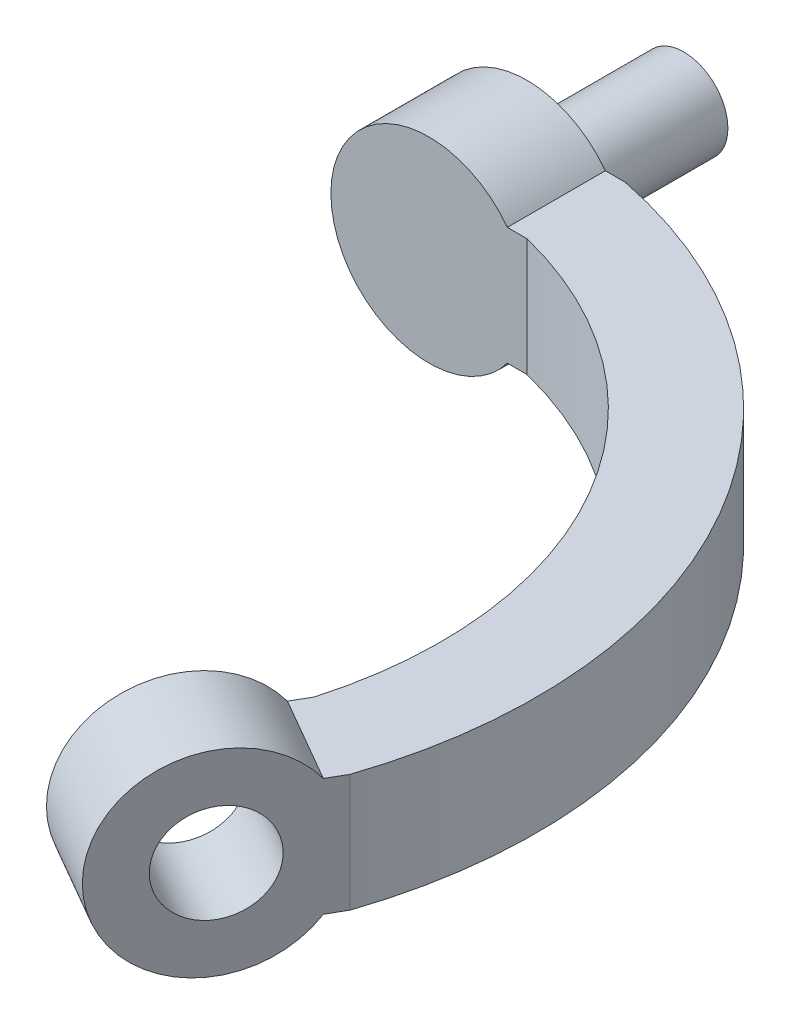
ISO-10303-21;
HEADER;
FILE_DESCRIPTION(('STEP AP214'),'2;1');
FILE_NAME('part.step','',(''),(''),'','','');
FILE_SCHEMA(('AUTOMOTIVE_DESIGN { 1 0 10303 214 1 1 1 1 }'));
ENDSEC;
DATA;
#1=APPLICATION_CONTEXT('core data for automotive mechanical design processes');
#2=APPLICATION_PROTOCOL_DEFINITION('international standard','automotive_design',2000,#1);
#3=PRODUCT_CONTEXT('',#1,'mechanical');
#4=PRODUCT('Part','Part','',(#3));
#5=PRODUCT_RELATED_PRODUCT_CATEGORY('part','',(#4));
#6=PRODUCT_DEFINITION_FORMATION('','',#4);
#7=PRODUCT_DEFINITION_CONTEXT('part definition',#1,'design');
#8=PRODUCT_DEFINITION('design','',#6,#7);
#9=PRODUCT_DEFINITION_SHAPE('','',#8);
#10=(LENGTH_UNIT() NAMED_UNIT(*) SI_UNIT(.MILLI.,.METRE.));
#11=(NAMED_UNIT(*) PLANE_ANGLE_UNIT() SI_UNIT($,.RADIAN.));
#12=(NAMED_UNIT(*) SI_UNIT($,.STERADIAN.) SOLID_ANGLE_UNIT());
#13=UNCERTAINTY_MEASURE_WITH_UNIT(LENGTH_MEASURE(1.E-05),#10,'distance_accuracy_value','');
#14=(GEOMETRIC_REPRESENTATION_CONTEXT(3) GLOBAL_UNCERTAINTY_ASSIGNED_CONTEXT((#13)) GLOBAL_UNIT_ASSIGNED_CONTEXT((#10,
#11,#12)) REPRESENTATION_CONTEXT('',''));
#15=CARTESIAN_POINT('',(0.,0.,0.));
#16=DIRECTION('',(0.,0.,1.));
#17=DIRECTION('',(1.,0.,0.));
#18=AXIS2_PLACEMENT_3D('',#15,#16,#17);
#19=CARTESIAN_POINT('',(0.,0.,5.));
#20=DIRECTION('',(0.,0.,-1.));
#21=DIRECTION('',(-1.,0.,0.));
#22=AXIS2_PLACEMENT_3D('',#19,#20,#21);
#23=CYLINDRICAL_SURFACE('',#22,5.);
#24=DIRECTION('',(0.,0.,-1.));
#25=VECTOR('',#24,1.);
#26=CARTESIAN_POINT('',(4.,-3.,5.));
#27=LINE('',#26,#25);
#28=CARTESIAN_POINT('',(4.,-3.,5.));
#29=VERTEX_POINT('',#28);
#30=CARTESIAN_POINT('',(4.,-3.,0.));
#31=VERTEX_POINT('',#30);
#32=EDGE_CURVE('E52',#29,#31,#27,.T.);
#33=ORIENTED_EDGE('',*,*,#32,.F.);
#34=CARTESIAN_POINT('',(0.,0.,5.));
#35=DIRECTION('',(0.,0.,1.));
#36=DIRECTION('',(1.,0.,0.));
#37=AXIS2_PLACEMENT_3D('',#34,#35,#36);
#38=CIRCLE('',#37,5.);
#39=CARTESIAN_POINT('',(4.,3.,5.));
#40=VERTEX_POINT('',#39);
#41=EDGE_CURVE('E11',#40,#29,#38,.T.);
#42=ORIENTED_EDGE('',*,*,#41,.F.);
#43=DIRECTION('',(0.,0.,-1.));
#44=VECTOR('',#43,1.);
#45=CARTESIAN_POINT('',(4.,3.,5.));
#46=LINE('',#45,#44);
#47=CARTESIAN_POINT('',(4.,3.,0.));
#48=VERTEX_POINT('',#47);
#49=EDGE_CURVE('E151',#48,#40,#46,.F.);
#50=ORIENTED_EDGE('',*,*,#49,.F.);
#51=CARTESIAN_POINT('',(0.,0.,0.));
#52=DIRECTION('',(0.,0.,1.));
#53=DIRECTION('',(1.,0.,0.));
#54=AXIS2_PLACEMENT_3D('',#51,#52,#53);
#55=CIRCLE('',#54,5.);
#56=EDGE_CURVE('E41',#48,#31,#55,.T.);
#57=ORIENTED_EDGE('',*,*,#56,.T.);
#58=EDGE_LOOP('',(#33,#42,#50,#57));
#59=FACE_BOUND('',#58,.T.);
#60=ADVANCED_FACE('F38',(#59),#23,.T.);
#61=CARTESIAN_POINT('',(0.,0.,5.));
#62=DIRECTION('',(0.,0.,1.));
#63=DIRECTION('',(1.,0.,0.));
#64=AXIS2_PLACEMENT_3D('',#61,#62,#63);
#65=PLANE('',#64);
#66=DIRECTION('',(1.,0.,0.));
#67=VECTOR('',#66,1.);
#68=CARTESIAN_POINT('',(2.,-3.,4.99999999999998));
#69=LINE('',#68,#67);
#70=CARTESIAN_POINT('',(4.9999999999999,-3.,4.99999999999998));
#71=VERTEX_POINT('',#70);
#72=EDGE_CURVE('E148',#29,#71,#69,.T.);
#73=ORIENTED_EDGE('',*,*,#72,.T.);
#74=DIRECTION('',(0.,1.,0.));
#75=VECTOR('',#74,1.);
#76=CARTESIAN_POINT('',(5.,-3.,4.99999999999998));
#77=LINE('',#76,#75);
#78=CARTESIAN_POINT('',(4.9999999999999,3.,4.99999999999998));
#79=VERTEX_POINT('',#78);
#80=EDGE_CURVE('E135',#71,#79,#77,.T.);
#81=ORIENTED_EDGE('',*,*,#80,.T.);
#82=DIRECTION('',(1.,0.,0.));
#83=VECTOR('',#82,1.);
#84=CARTESIAN_POINT('',(2.,3.,4.99999999999998));
#85=LINE('',#84,#83);
#86=EDGE_CURVE('E123',#40,#79,#85,.T.);
#87=ORIENTED_EDGE('',*,*,#86,.F.);
#88=ORIENTED_EDGE('',*,*,#41,.T.);
#89=EDGE_LOOP('',(#73,#81,#87,#88));
#90=FACE_BOUND('',#89,.T.);
#91=ADVANCED_FACE('F207',(#90),#65,.T.);
#92=CARTESIAN_POINT('',(0.,0.,0.));
#93=DIRECTION('',(0.,0.,1.));
#94=DIRECTION('',(1.,0.,0.));
#95=AXIS2_PLACEMENT_3D('',#92,#93,#94);
#96=PLANE('',#95);
#97=CARTESIAN_POINT('',(0.,0.,0.));
#98=DIRECTION('',(0.,0.,1.));
#99=DIRECTION('',(1.,0.,0.));
#100=AXIS2_PLACEMENT_3D('',#97,#98,#99);
#101=CIRCLE('',#100,2.25);
#102=CARTESIAN_POINT('',(2.25,0.,0.));
#103=VERTEX_POINT('',#102);
#104=EDGE_CURVE('E189',#103,#103,#101,.T.);
#105=ORIENTED_EDGE('',*,*,#104,.T.);
#106=EDGE_LOOP('',(#105));
#107=FACE_BOUND('',#106,.T.);
#108=ORIENTED_EDGE('',*,*,#56,.F.);
#109=DIRECTION('',(1.,0.,0.));
#110=VECTOR('',#109,1.);
#111=CARTESIAN_POINT('',(2.,3.,0.));
#112=LINE('',#111,#110);
#113=CARTESIAN_POINT('',(5.,3.,0.));
#114=VERTEX_POINT('',#113);
#115=EDGE_CURVE('E144',#48,#114,#112,.T.);
#116=ORIENTED_EDGE('',*,*,#115,.T.);
#117=DIRECTION('',(0.,-1.,0.));
#118=VECTOR('',#117,1.);
#119=CARTESIAN_POINT('',(5.,3.,0.));
#120=LINE('',#119,#118);
#121=CARTESIAN_POINT('',(5.,-3.,0.));
#122=VERTEX_POINT('',#121);
#123=EDGE_CURVE('E138',#114,#122,#120,.T.);
#124=ORIENTED_EDGE('',*,*,#123,.T.);
#125=DIRECTION('',(1.,0.,0.));
#126=VECTOR('',#125,1.);
#127=CARTESIAN_POINT('',(2.,-3.,0.));
#128=LINE('',#127,#126);
#129=EDGE_CURVE('E141',#31,#122,#128,.T.);
#130=ORIENTED_EDGE('',*,*,#129,.F.);
#131=EDGE_LOOP('',(#108,#116,#124,#130));
#132=FACE_BOUND('',#131,.T.);
#133=ADVANCED_FACE('F158',(#107,#132),#96,.F.);
#134=CARTESIAN_POINT('',(2.,-3.,0.));
#135=DIRECTION('',(0.,1.,0.));
#136=DIRECTION('',(0.,0.,1.));
#137=AXIS2_PLACEMENT_3D('',#134,#135,#136);
#138=PLANE('',#137);
#139=ORIENTED_EDGE('',*,*,#72,.F.);
#140=ORIENTED_EDGE('',*,*,#32,.T.);
#141=ORIENTED_EDGE('',*,*,#129,.T.);
#142=CARTESIAN_POINT('',(0.,-3.,25.));
#143=DIRECTION('',(0.,1.,0.));
#144=DIRECTION('',(0.,0.,1.));
#145=AXIS2_PLACEMENT_3D('',#142,#143,#144);
#146=CIRCLE('',#145,25.4950975679639);
#147=CARTESIAN_POINT('',(24.150635094611,-3.,33.1698729810778));
#148=VERTEX_POINT('',#147);
#149=EDGE_CURVE('E125',#122,#148,#146,.F.);
#150=ORIENTED_EDGE('',*,*,#149,.T.);
#151=DIRECTION('',(0.499999999999998,0.,-0.866025403784439));
#152=VECTOR('',#151,1.);
#153=CARTESIAN_POINT('',(22.650635094611,-3.,35.7679491924311));
#154=LINE('',#153,#152);
#155=CARTESIAN_POINT('',(23.650635094611,-3.,34.0358983848622));
#156=VERTEX_POINT('',#155);
#157=EDGE_CURVE('E166',#156,#148,#154,.T.);
#158=ORIENTED_EDGE('',*,*,#157,.F.);
#159=DIRECTION('',(-0.86602540378444,0.,-0.499999999999997));
#160=VECTOR('',#159,1.);
#161=CARTESIAN_POINT('',(1.99999999999998,-3.,21.5358983848623));
#162=LINE('',#161,#160);
#163=CARTESIAN_POINT('',(19.3205080756888,-3.,31.5358983848622));
#164=VERTEX_POINT('',#163);
#165=EDGE_CURVE('E173',#156,#164,#162,.T.);
#166=ORIENTED_EDGE('',*,*,#165,.T.);
#167=DIRECTION('',(0.499999999999998,0.,-0.866025403784439));
#168=VECTOR('',#167,1.);
#169=CARTESIAN_POINT('',(18.3205080756888,-3.,33.2679491924311));
#170=LINE('',#169,#168);
#171=CARTESIAN_POINT('',(19.8205080756888,-3.,30.6698729810778));
#172=VERTEX_POINT('',#171);
#173=EDGE_CURVE('E118',#164,#172,#170,.T.);
#174=ORIENTED_EDGE('',*,*,#173,.T.);
#175=CARTESIAN_POINT('',(0.,-3.,25.));
#176=DIRECTION('',(0.,1.,0.));
#177=DIRECTION('',(0.,0.,1.));
#178=AXIS2_PLACEMENT_3D('',#175,#176,#177);
#179=CIRCLE('',#178,20.6155281280883);
#180=EDGE_CURVE('E105',#71,#172,#179,.F.);
#181=ORIENTED_EDGE('',*,*,#180,.F.);
#182=EDGE_LOOP('',(#139,#140,#141,#150,#158,#166,#174,#181));
#183=FACE_BOUND('',#182,.T.);
#184=ADVANCED_FACE('F165',(#183),#138,.F.);
#185=CARTESIAN_POINT('',(2.,3.,4.99999999999998));
#186=DIRECTION('',(0.,-1.,0.));
#187=DIRECTION('',(0.,0.,-1.));
#188=AXIS2_PLACEMENT_3D('',#185,#186,#187);
#189=PLANE('',#188);
#190=ORIENTED_EDGE('',*,*,#115,.F.);
#191=ORIENTED_EDGE('',*,*,#49,.T.);
#192=ORIENTED_EDGE('',*,*,#86,.T.);
#193=CARTESIAN_POINT('',(0.,3.,25.));
#194=DIRECTION('',(0.,1.,0.));
#195=DIRECTION('',(0.,0.,1.));
#196=AXIS2_PLACEMENT_3D('',#193,#194,#195);
#197=CIRCLE('',#196,20.6155281280883);
#198=CARTESIAN_POINT('',(19.8205080756888,3.,30.6698729810778));
#199=VERTEX_POINT('',#198);
#200=EDGE_CURVE('E102',#79,#199,#197,.F.);
#201=ORIENTED_EDGE('',*,*,#200,.T.);
#202=DIRECTION('',(0.499999999999998,0.,-0.866025403784439));
#203=VECTOR('',#202,1.);
#204=CARTESIAN_POINT('',(18.3205080756888,3.,33.2679491924311));
#205=LINE('',#204,#203);
#206=CARTESIAN_POINT('',(19.3205080756888,3.,31.5358983848622));
#207=VERTEX_POINT('',#206);
#208=EDGE_CURVE('E111',#207,#199,#205,.T.);
#209=ORIENTED_EDGE('',*,*,#208,.F.);
#210=DIRECTION('',(-0.86602540378444,0.,-0.499999999999997));
#211=VECTOR('',#210,1.);
#212=CARTESIAN_POINT('',(1.99999999999998,3.,21.5358983848623));
#213=LINE('',#212,#211);
#214=CARTESIAN_POINT('',(23.650635094611,3.,34.0358983848622));
#215=VERTEX_POINT('',#214);
#216=EDGE_CURVE('E176',#215,#207,#213,.T.);
#217=ORIENTED_EDGE('',*,*,#216,.F.);
#218=DIRECTION('',(0.499999999999998,0.,-0.866025403784439));
#219=VECTOR('',#218,1.);
#220=CARTESIAN_POINT('',(22.650635094611,3.,35.7679491924311));
#221=LINE('',#220,#219);
#222=CARTESIAN_POINT('',(24.150635094611,3.,33.1698729810777));
#223=VERTEX_POINT('',#222);
#224=EDGE_CURVE('E117',#215,#223,#221,.T.);
#225=ORIENTED_EDGE('',*,*,#224,.T.);
#226=CARTESIAN_POINT('',(0.,3.,25.));
#227=DIRECTION('',(0.,1.,0.));
#228=DIRECTION('',(0.,0.,1.));
#229=AXIS2_PLACEMENT_3D('',#226,#227,#228);
#230=CIRCLE('',#229,25.4950975679639);
#231=EDGE_CURVE('E126',#114,#223,#230,.F.);
#232=ORIENTED_EDGE('',*,*,#231,.F.);
#233=EDGE_LOOP('',(#190,#191,#192,#201,#209,#217,#225,#232));
#234=FACE_BOUND('',#233,.T.);
#235=ADVANCED_FACE('F121',(#234),#189,.F.);
#236=CARTESIAN_POINT('',(0.,-3.,25.));
#237=DIRECTION('',(0.,1.,0.));
#238=DIRECTION('',(0.,0.,1.));
#239=AXIS2_PLACEMENT_3D('',#236,#237,#238);
#240=CYLINDRICAL_SURFACE('',#239,25.4950975679639);
#241=ORIENTED_EDGE('',*,*,#123,.F.);
#242=ORIENTED_EDGE('',*,*,#231,.T.);
#243=DIRECTION('',(0.,1.,0.));
#244=VECTOR('',#243,1.);
#245=CARTESIAN_POINT('',(24.150635094611,-3.,33.1698729810777));
#246=LINE('',#245,#244);
#247=EDGE_CURVE('E108',#148,#223,#246,.T.);
#248=ORIENTED_EDGE('',*,*,#247,.F.);
#249=ORIENTED_EDGE('',*,*,#149,.F.);
#250=EDGE_LOOP('',(#241,#242,#248,#249));
#251=FACE_BOUND('',#250,.T.);
#252=ADVANCED_FACE('F164',(#251),#240,.T.);
#253=CARTESIAN_POINT('',(0.,-3.,25.));
#254=DIRECTION('',(0.,1.,0.));
#255=DIRECTION('',(0.,0.,1.));
#256=AXIS2_PLACEMENT_3D('',#253,#254,#255);
#257=CYLINDRICAL_SURFACE('',#256,20.6155281280883);
#258=DIRECTION('',(0.,1.,0.));
#259=VECTOR('',#258,1.);
#260=CARTESIAN_POINT('',(19.8205080756888,-3.,30.6698729810777));
#261=LINE('',#260,#259);
#262=EDGE_CURVE('E98',#172,#199,#261,.T.);
#263=ORIENTED_EDGE('',*,*,#262,.T.);
#264=ORIENTED_EDGE('',*,*,#200,.F.);
#265=ORIENTED_EDGE('',*,*,#80,.F.);
#266=ORIENTED_EDGE('',*,*,#180,.T.);
#267=EDGE_LOOP('',(#263,#264,#265,#266));
#268=FACE_BOUND('',#267,.T.);
#269=ADVANCED_FACE('F100',(#268),#257,.F.);
#270=CARTESIAN_POINT('',(22.650635094611,-3.,35.7679491924311));
#271=DIRECTION('',(-0.866025403784439,0.,-0.499999999999998));
#272=DIRECTION('',(-0.499999999999999,0.,0.86602540378444));
#273=AXIS2_PLACEMENT_3D('',#270,#271,#272);
#274=PLANE('',#273);
#275=CARTESIAN_POINT('',(21.650635094611,0.,37.4999999999999));
#276=DIRECTION('',(-0.86602540378444,0.,-0.499999999999999));
#277=DIRECTION('',(-0.499999999999999,0.,0.86602540378444));
#278=AXIS2_PLACEMENT_3D('',#275,#276,#277);
#279=CIRCLE('',#278,2.5);
#280=CARTESIAN_POINT('',(20.400635094611,0.,39.665063509461));
#281=VERTEX_POINT('',#280);
#282=EDGE_CURVE('E182',#281,#281,#279,.T.);
#283=ORIENTED_EDGE('',*,*,#282,.T.);
#284=EDGE_LOOP('',(#283));
#285=FACE_BOUND('',#284,.T.);
#286=CARTESIAN_POINT('',(21.650635094611,0.,37.4999999999999));
#287=DIRECTION('',(-0.86602540378444,0.,-0.499999999999997));
#288=DIRECTION('',(-0.499999999999997,0.,0.86602540378444));
#289=AXIS2_PLACEMENT_3D('',#286,#287,#288);
#290=CIRCLE('',#289,4.99999999999998);
#291=EDGE_CURVE('E172',#156,#215,#290,.T.);
#292=ORIENTED_EDGE('',*,*,#291,.F.);
#293=ORIENTED_EDGE('',*,*,#157,.T.);
#294=ORIENTED_EDGE('',*,*,#247,.T.);
#295=ORIENTED_EDGE('',*,*,#224,.F.);
#296=EDGE_LOOP('',(#292,#293,#294,#295));
#297=FACE_BOUND('',#296,.T.);
#298=ADVANCED_FACE('F170',(#285,#297),#274,.F.);
#299=CARTESIAN_POINT('',(18.3205080756888,3.,33.2679491924311));
#300=DIRECTION('',(0.866025403784439,0.,0.499999999999998));
#301=DIRECTION('',(0.499999999999999,0.,-0.86602540378444));
#302=AXIS2_PLACEMENT_3D('',#299,#300,#301);
#303=PLANE('',#302);
#304=CARTESIAN_POINT('',(17.3205080756888,0.,34.9999999999999));
#305=DIRECTION('',(-0.86602540378444,0.,-0.499999999999999));
#306=DIRECTION('',(-0.499999999999999,0.,0.86602540378444));
#307=AXIS2_PLACEMENT_3D('',#304,#305,#306);
#308=CIRCLE('',#307,2.5);
#309=CARTESIAN_POINT('',(16.0705080756888,0.,37.165063509461));
#310=VERTEX_POINT('',#309);
#311=EDGE_CURVE('E183',#310,#310,#308,.T.);
#312=ORIENTED_EDGE('',*,*,#311,.F.);
#313=EDGE_LOOP('',(#312));
#314=FACE_BOUND('',#313,.T.);
#315=ORIENTED_EDGE('',*,*,#173,.F.);
#316=CARTESIAN_POINT('',(17.3205080756888,0.,34.9999999999999));
#317=DIRECTION('',(-0.86602540378444,0.,-0.499999999999997));
#318=DIRECTION('',(-0.499999999999997,0.,0.86602540378444));
#319=AXIS2_PLACEMENT_3D('',#316,#317,#318);
#320=CIRCLE('',#319,4.99999999999999);
#321=EDGE_CURVE('E114',#164,#207,#320,.T.);
#322=ORIENTED_EDGE('',*,*,#321,.T.);
#323=ORIENTED_EDGE('',*,*,#208,.T.);
#324=ORIENTED_EDGE('',*,*,#262,.F.);
#325=EDGE_LOOP('',(#315,#322,#323,#324));
#326=FACE_BOUND('',#325,.T.);
#327=ADVANCED_FACE('F112',(#314,#326),#303,.F.);
#328=CARTESIAN_POINT('',(0.,0.,25.));
#329=DIRECTION('',(-0.86602540378444,0.,-0.499999999999997));
#330=DIRECTION('',(-0.499999999999997,0.,0.86602540378444));
#331=AXIS2_PLACEMENT_3D('',#328,#329,#330);
#332=CYLINDRICAL_SURFACE('',#331,4.99999999999998);
#333=ORIENTED_EDGE('',*,*,#165,.F.);
#334=ORIENTED_EDGE('',*,*,#291,.T.);
#335=ORIENTED_EDGE('',*,*,#216,.T.);
#336=ORIENTED_EDGE('',*,*,#321,.F.);
#337=EDGE_LOOP('',(#333,#334,#335,#336));
#338=FACE_BOUND('',#337,.T.);
#339=ADVANCED_FACE('F231',(#338),#332,.T.);
#340=CARTESIAN_POINT('',(21.650635094611,0.,37.4999999999999));
#341=DIRECTION('',(-0.86602540378444,0.,-0.499999999999998));
#342=DIRECTION('',(-0.499999999999998,0.,0.86602540378444));
#343=AXIS2_PLACEMENT_3D('',#340,#341,#342);
#344=CYLINDRICAL_SURFACE('',#343,2.5);
#345=ORIENTED_EDGE('',*,*,#282,.F.);
#346=EDGE_LOOP('',(#345));
#347=FACE_BOUND('',#346,.T.);
#348=ORIENTED_EDGE('',*,*,#311,.T.);
#349=EDGE_LOOP('',(#348));
#350=FACE_BOUND('',#349,.T.);
#351=ADVANCED_FACE('F204',(#347,#350),#344,.F.);
#352=CARTESIAN_POINT('',(0.,0.,-8.));
#353=DIRECTION('',(0.,0.,1.));
#354=DIRECTION('',(1.,0.,0.));
#355=AXIS2_PLACEMENT_3D('',#352,#353,#354);
#356=CYLINDRICAL_SURFACE('',#355,2.25);
#357=CARTESIAN_POINT('',(0.,0.,-8.));
#358=DIRECTION('',(0.,0.,1.));
#359=DIRECTION('',(1.,0.,0.));
#360=AXIS2_PLACEMENT_3D('',#357,#358,#359);
#361=CIRCLE('',#360,2.25);
#362=CARTESIAN_POINT('',(2.25,0.,-8.));
#363=VERTEX_POINT('',#362);
#364=EDGE_CURVE('E186',#363,#363,#361,.T.);
#365=ORIENTED_EDGE('',*,*,#364,.T.);
#366=EDGE_LOOP('',(#365));
#367=FACE_BOUND('',#366,.T.);
#368=ORIENTED_EDGE('',*,*,#104,.F.);
#369=EDGE_LOOP('',(#368));
#370=FACE_BOUND('',#369,.T.);
#371=ADVANCED_FACE('F195',(#367,#370),#356,.T.);
#372=CARTESIAN_POINT('',(0.,0.,-8.));
#373=DIRECTION('',(0.,0.,1.));
#374=DIRECTION('',(1.,0.,0.));
#375=AXIS2_PLACEMENT_3D('',#372,#373,#374);
#376=PLANE('',#375);
#377=ORIENTED_EDGE('',*,*,#364,.F.);
#378=EDGE_LOOP('',(#377));
#379=FACE_BOUND('',#378,.T.);
#380=ADVANCED_FACE('F198',(#379),#376,.F.);
#381=CLOSED_SHELL('',(#60,#91,#133,#184,#235,#252,#269,#298,#327,#339,#351,#371,#380));
#382=MANIFOLD_SOLID_BREP('B2',#381);
#383=ADVANCED_BREP_SHAPE_REPRESENTATION('',(#18,#382),#14);
#384=SHAPE_DEFINITION_REPRESENTATION(#9,#383);
ENDSEC;
END-ISO-10303-21;
